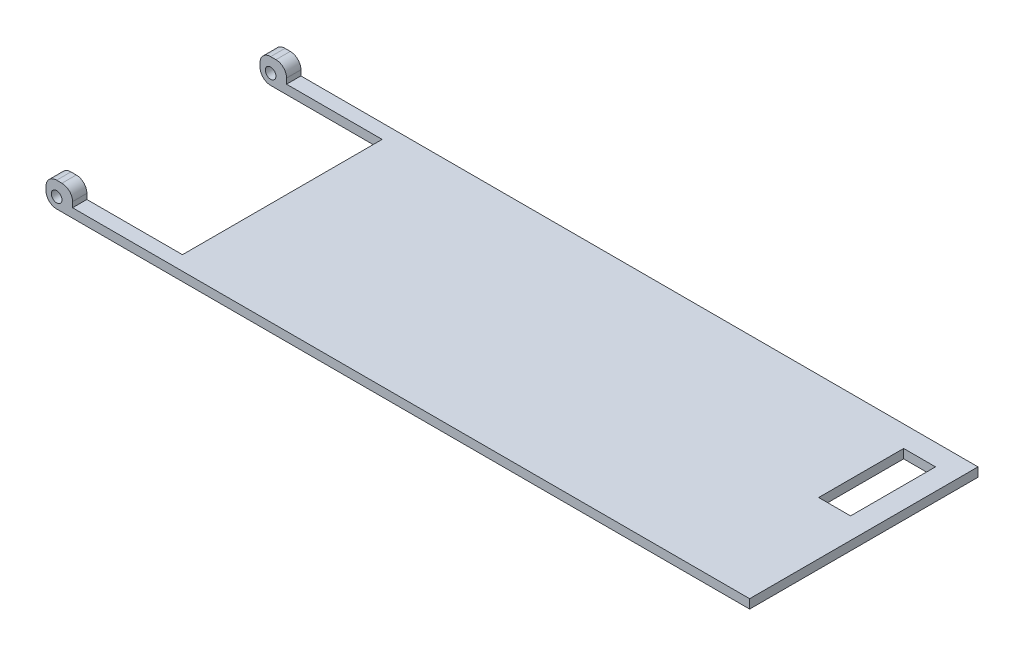
ISO-10303-21;
HEADER;
FILE_DESCRIPTION(('STEP AP214'),'2;1');
FILE_NAME('part.step','',(''),(''),'','','');
FILE_SCHEMA(('AUTOMOTIVE_DESIGN { 1 0 10303 214 1 1 1 1 }'));
ENDSEC;
DATA;
#1=APPLICATION_CONTEXT('core data for automotive mechanical design processes');
#2=APPLICATION_PROTOCOL_DEFINITION('international standard','automotive_design',2000,#1);
#3=PRODUCT_CONTEXT('',#1,'mechanical');
#4=PRODUCT('Part','Part','',(#3));
#5=PRODUCT_RELATED_PRODUCT_CATEGORY('part','',(#4));
#6=PRODUCT_DEFINITION_FORMATION('','',#4);
#7=PRODUCT_DEFINITION_CONTEXT('part definition',#1,'design');
#8=PRODUCT_DEFINITION('design','',#6,#7);
#9=PRODUCT_DEFINITION_SHAPE('','',#8);
#10=(LENGTH_UNIT() NAMED_UNIT(*) SI_UNIT(.MILLI.,.METRE.));
#11=(NAMED_UNIT(*) PLANE_ANGLE_UNIT() SI_UNIT($,.RADIAN.));
#12=(NAMED_UNIT(*) SI_UNIT($,.STERADIAN.) SOLID_ANGLE_UNIT());
#13=UNCERTAINTY_MEASURE_WITH_UNIT(LENGTH_MEASURE(1.E-05),#10,'distance_accuracy_value','');
#14=(GEOMETRIC_REPRESENTATION_CONTEXT(3) GLOBAL_UNCERTAINTY_ASSIGNED_CONTEXT((#13)) GLOBAL_UNIT_ASSIGNED_CONTEXT((#10,
#11,#12)) REPRESENTATION_CONTEXT('',''));
#15=CARTESIAN_POINT('',(0.,0.,0.));
#16=DIRECTION('',(0.,0.,1.));
#17=DIRECTION('',(1.,0.,0.));
#18=AXIS2_PLACEMENT_3D('',#15,#16,#17);
#19=CARTESIAN_POINT('',(0.,1.7,0.));
#20=DIRECTION('',(0.,-1.,0.));
#21=DIRECTION('',(0.,0.,-1.));
#22=AXIS2_PLACEMENT_3D('',#19,#20,#21);
#23=PLANE('',#22);
#24=DIRECTION('',(-1.,0.,0.));
#25=VECTOR('',#24,1.);
#26=CARTESIAN_POINT('',(56.25,1.7,-17.5));
#27=LINE('',#26,#25);
#28=CARTESIAN_POINT('',(62.25,1.7,-17.5));
#29=VERTEX_POINT('',#28);
#30=CARTESIAN_POINT('',(56.25,1.7,-17.5));
#31=VERTEX_POINT('',#30);
#32=EDGE_CURVE('E228',#29,#31,#27,.T.);
#33=ORIENTED_EDGE('',*,*,#32,.F.);
#34=DIRECTION('',(0.,0.,-1.));
#35=VECTOR('',#34,1.);
#36=CARTESIAN_POINT('',(62.25,1.7,-1.5));
#37=LINE('',#36,#35);
#38=CARTESIAN_POINT('',(62.25,1.7,-1.5));
#39=VERTEX_POINT('',#38);
#40=EDGE_CURVE('E61',#39,#29,#37,.T.);
#41=ORIENTED_EDGE('',*,*,#40,.F.);
#42=DIRECTION('',(1.,0.,0.));
#43=VECTOR('',#42,1.);
#44=CARTESIAN_POINT('',(56.25,1.7,-1.5));
#45=LINE('',#44,#43);
#46=CARTESIAN_POINT('',(56.25,1.7,-1.5));
#47=VERTEX_POINT('',#46);
#48=EDGE_CURVE('E215',#47,#39,#45,.T.);
#49=ORIENTED_EDGE('',*,*,#48,.F.);
#50=DIRECTION('',(0.,0.,1.));
#51=VECTOR('',#50,1.);
#52=CARTESIAN_POINT('',(56.25,1.7,-1.5));
#53=LINE('',#52,#51);
#54=EDGE_CURVE('E219',#31,#47,#53,.T.);
#55=ORIENTED_EDGE('',*,*,#54,.F.);
#56=EDGE_LOOP('',(#33,#41,#49,#55));
#57=FACE_BOUND('',#56,.T.);
#58=DIRECTION('',(-1.,0.,0.));
#59=VECTOR('',#58,1.);
#60=CARTESIAN_POINT('',(-66.25,1.7,-21.5));
#61=LINE('',#60,#59);
#62=CARTESIAN_POINT('',(66.25,1.7,-21.5));
#63=VERTEX_POINT('',#62);
#64=CARTESIAN_POINT('',(-61.25,1.7,-21.5));
#65=VERTEX_POINT('',#64);
#66=EDGE_CURVE('E336',#63,#65,#61,.T.);
#67=ORIENTED_EDGE('',*,*,#66,.T.);
#68=DIRECTION('',(0.,0.,1.));
#69=VECTOR('',#68,1.);
#70=CARTESIAN_POINT('',(-61.25,1.7,-18.8));
#71=LINE('',#70,#69);
#72=CARTESIAN_POINT('',(-61.25,1.7,-18.8));
#73=VERTEX_POINT('',#72);
#74=EDGE_CURVE('E247',#65,#73,#71,.T.);
#75=ORIENTED_EDGE('',*,*,#74,.T.);
#76=DIRECTION('',(-1.,0.,0.));
#77=VECTOR('',#76,1.);
#78=CARTESIAN_POINT('',(-66.25,1.7,-18.8));
#79=LINE('',#78,#77);
#80=CARTESIAN_POINT('',(-43.25,1.7,-18.8));
#81=VERTEX_POINT('',#80);
#82=EDGE_CURVE('E299',#81,#73,#79,.T.);
#83=ORIENTED_EDGE('',*,*,#82,.F.);
#84=DIRECTION('',(0.,0.,-1.));
#85=VECTOR('',#84,1.);
#86=CARTESIAN_POINT('',(-43.25,1.7,18.8));
#87=LINE('',#86,#85);
#88=CARTESIAN_POINT('',(-43.25,1.7,18.8));
#89=VERTEX_POINT('',#88);
#90=EDGE_CURVE('E310',#89,#81,#87,.T.);
#91=ORIENTED_EDGE('',*,*,#90,.F.);
#92=DIRECTION('',(1.,0.,0.));
#93=VECTOR('',#92,1.);
#94=CARTESIAN_POINT('',(-66.25,1.7,18.8));
#95=LINE('',#94,#93);
#96=CARTESIAN_POINT('',(-61.25,1.7,18.8));
#97=VERTEX_POINT('',#96);
#98=EDGE_CURVE('E294',#97,#89,#95,.T.);
#99=ORIENTED_EDGE('',*,*,#98,.F.);
#100=DIRECTION('',(0.,0.,-1.));
#101=VECTOR('',#100,1.);
#102=CARTESIAN_POINT('',(-61.25,1.7,18.8));
#103=LINE('',#102,#101);
#104=CARTESIAN_POINT('',(-61.25,1.7,21.5));
#105=VERTEX_POINT('',#104);
#106=EDGE_CURVE('E273',#105,#97,#103,.T.);
#107=ORIENTED_EDGE('',*,*,#106,.F.);
#108=DIRECTION('',(1.,0.,0.));
#109=VECTOR('',#108,1.);
#110=CARTESIAN_POINT('',(-66.25,1.7,21.5));
#111=LINE('',#110,#109);
#112=CARTESIAN_POINT('',(66.25,1.7,21.5));
#113=VERTEX_POINT('',#112);
#114=EDGE_CURVE('E341',#105,#113,#111,.T.);
#115=ORIENTED_EDGE('',*,*,#114,.T.);
#116=DIRECTION('',(0.,0.,-1.));
#117=VECTOR('',#116,1.);
#118=CARTESIAN_POINT('',(66.25,1.7,21.5));
#119=LINE('',#118,#117);
#120=EDGE_CURVE('E332',#113,#63,#119,.T.);
#121=ORIENTED_EDGE('',*,*,#120,.T.);
#122=EDGE_LOOP('',(#67,#75,#83,#91,#99,#107,#115,#121));
#123=FACE_BOUND('',#122,.T.);
#124=ADVANCED_FACE('F45',(#57,#123),#23,.F.);
#125=CARTESIAN_POINT('',(-66.25,1.7,21.5));
#126=DIRECTION('',(1.,0.,0.));
#127=DIRECTION('',(0.,0.,-1.));
#128=AXIS2_PLACEMENT_3D('',#125,#126,#127);
#129=PLANE('',#128);
#130=DIRECTION('',(0.,-1.,0.));
#131=VECTOR('',#130,1.);
#132=CARTESIAN_POINT('',(-66.25,1.7,-21.5));
#133=LINE('',#132,#131);
#134=CARTESIAN_POINT('',(-66.25,2.7,-21.5));
#135=VERTEX_POINT('',#134);
#136=CARTESIAN_POINT('',(-66.25,2.,-21.5));
#137=VERTEX_POINT('',#136);
#138=EDGE_CURVE('E361',#135,#137,#133,.T.);
#139=ORIENTED_EDGE('',*,*,#138,.T.);
#140=DIRECTION('',(0.,0.,1.));
#141=VECTOR('',#140,1.);
#142=CARTESIAN_POINT('',(-66.25,2.,-18.8));
#143=LINE('',#142,#141);
#144=CARTESIAN_POINT('',(-66.25,2.,-18.8));
#145=VERTEX_POINT('',#144);
#146=EDGE_CURVE('E412',#137,#145,#143,.T.);
#147=ORIENTED_EDGE('',*,*,#146,.T.);
#148=DIRECTION('',(0.,1.,0.));
#149=VECTOR('',#148,1.);
#150=CARTESIAN_POINT('',(-66.25,0.,-18.8));
#151=LINE('',#150,#149);
#152=CARTESIAN_POINT('',(-66.25,2.7,-18.8));
#153=VERTEX_POINT('',#152);
#154=EDGE_CURVE('E317',#145,#153,#151,.T.);
#155=ORIENTED_EDGE('',*,*,#154,.T.);
#156=DIRECTION('',(0.,0.,-1.));
#157=VECTOR('',#156,1.);
#158=CARTESIAN_POINT('',(-66.25,2.7,-21.5));
#159=LINE('',#158,#157);
#160=EDGE_CURVE('E408',#153,#135,#159,.T.);
#161=ORIENTED_EDGE('',*,*,#160,.T.);
#162=EDGE_LOOP('',(#139,#147,#155,#161));
#163=FACE_BOUND('',#162,.T.);
#164=ADVANCED_FACE('F456',(#163),#129,.F.);
#165=CARTESIAN_POINT('',(66.25,1.7,21.5));
#166=DIRECTION('',(-1.,0.,0.));
#167=DIRECTION('',(0.,0.,1.));
#168=AXIS2_PLACEMENT_3D('',#165,#166,#167);
#169=PLANE('',#168);
#170=DIRECTION('',(0.,0.,-1.));
#171=VECTOR('',#170,1.);
#172=CARTESIAN_POINT('',(66.25,0.,21.5));
#173=LINE('',#172,#171);
#174=CARTESIAN_POINT('',(66.25,0.,21.5));
#175=VERTEX_POINT('',#174);
#176=CARTESIAN_POINT('',(66.25,0.,-21.5));
#177=VERTEX_POINT('',#176);
#178=EDGE_CURVE('E321',#175,#177,#173,.T.);
#179=ORIENTED_EDGE('',*,*,#178,.T.);
#180=DIRECTION('',(0.,-1.,0.));
#181=VECTOR('',#180,1.);
#182=CARTESIAN_POINT('',(66.25,1.7,-21.5));
#183=LINE('',#182,#181);
#184=EDGE_CURVE('E365',#63,#177,#183,.T.);
#185=ORIENTED_EDGE('',*,*,#184,.F.);
#186=ORIENTED_EDGE('',*,*,#120,.F.);
#187=DIRECTION('',(0.,-1.,0.));
#188=VECTOR('',#187,1.);
#189=CARTESIAN_POINT('',(66.25,1.7,21.5));
#190=LINE('',#189,#188);
#191=EDGE_CURVE('E344',#113,#175,#190,.T.);
#192=ORIENTED_EDGE('',*,*,#191,.T.);
#193=EDGE_LOOP('',(#179,#185,#186,#192));
#194=FACE_BOUND('',#193,.T.);
#195=ADVANCED_FACE('F512',(#194),#169,.F.);
#196=CARTESIAN_POINT('',(-66.25,1.7,-21.5));
#197=DIRECTION('',(0.,0.,1.));
#198=DIRECTION('',(1.,0.,0.));
#199=AXIS2_PLACEMENT_3D('',#196,#197,#198);
#200=PLANE('',#199);
#201=CARTESIAN_POINT('',(-64.25,2.,-21.5));
#202=DIRECTION('',(0.,0.,1.));
#203=DIRECTION('',(1.,0.,0.));
#204=AXIS2_PLACEMENT_3D('',#201,#202,#203);
#205=CIRCLE('',#204,0.999999999999998);
#206=CARTESIAN_POINT('',(-65.25,2.,-21.5));
#207=VERTEX_POINT('',#206);
#208=EDGE_CURVE('E237',#207,#207,#205,.T.);
#209=ORIENTED_EDGE('',*,*,#208,.T.);
#210=EDGE_LOOP('',(#209));
#211=FACE_BOUND('',#210,.T.);
#212=DIRECTION('',(-1.,0.,0.));
#213=VECTOR('',#212,1.);
#214=CARTESIAN_POINT('',(-66.25,0.,-21.5));
#215=LINE('',#214,#213);
#216=CARTESIAN_POINT('',(-64.25,0.,-21.5));
#217=VERTEX_POINT('',#216);
#218=EDGE_CURVE('E348',#177,#217,#215,.T.);
#219=ORIENTED_EDGE('',*,*,#218,.T.);
#220=CARTESIAN_POINT('',(-64.25,2.,-21.5));
#221=DIRECTION('',(0.,0.,1.));
#222=DIRECTION('',(1.,0.,0.));
#223=AXIS2_PLACEMENT_3D('',#220,#221,#222);
#224=CIRCLE('',#223,2.);
#225=EDGE_CURVE('E434',#217,#137,#224,.F.);
#226=ORIENTED_EDGE('',*,*,#225,.T.);
#227=ORIENTED_EDGE('',*,*,#138,.F.);
#228=CARTESIAN_POINT('',(-64.25,2.7,-21.5));
#229=DIRECTION('',(0.,0.,1.));
#230=DIRECTION('',(1.,0.,0.));
#231=AXIS2_PLACEMENT_3D('',#228,#229,#230);
#232=CIRCLE('',#231,2.);
#233=CARTESIAN_POINT('',(-64.25,4.7,-21.5));
#234=VERTEX_POINT('',#233);
#235=EDGE_CURVE('E428',#135,#234,#232,.F.);
#236=ORIENTED_EDGE('',*,*,#235,.T.);
#237=DIRECTION('',(1.,0.,0.));
#238=VECTOR('',#237,1.);
#239=CARTESIAN_POINT('',(-66.25,4.7,-21.5));
#240=LINE('',#239,#238);
#241=CARTESIAN_POINT('',(-63.25,4.7,-21.5));
#242=VERTEX_POINT('',#241);
#243=EDGE_CURVE('E255',#234,#242,#240,.T.);
#244=ORIENTED_EDGE('',*,*,#243,.T.);
#245=CARTESIAN_POINT('',(-63.25,2.7,-21.5));
#246=DIRECTION('',(0.,0.,1.));
#247=DIRECTION('',(1.,0.,0.));
#248=AXIS2_PLACEMENT_3D('',#245,#246,#247);
#249=CIRCLE('',#248,2.);
#250=CARTESIAN_POINT('',(-61.25,2.7,-21.5));
#251=VERTEX_POINT('',#250);
#252=EDGE_CURVE('E431',#242,#251,#249,.F.);
#253=ORIENTED_EDGE('',*,*,#252,.T.);
#254=DIRECTION('',(0.,-1.,0.));
#255=VECTOR('',#254,1.);
#256=CARTESIAN_POINT('',(-61.25,4.7,-21.5));
#257=LINE('',#256,#255);
#258=EDGE_CURVE('E259',#251,#65,#257,.T.);
#259=ORIENTED_EDGE('',*,*,#258,.T.);
#260=ORIENTED_EDGE('',*,*,#66,.F.);
#261=ORIENTED_EDGE('',*,*,#184,.T.);
#262=EDGE_LOOP('',(#219,#226,#227,#236,#244,#253,#259,#260,#261));
#263=FACE_BOUND('',#262,.T.);
#264=ADVANCED_FACE('F459',(#211,#263),#200,.F.);
#265=DIRECTION('',(0.,1.,0.));
#266=VECTOR('',#265,1.);
#267=CARTESIAN_POINT('',(-66.25,0.,18.8));
#268=LINE('',#267,#266);
#269=CARTESIAN_POINT('',(-66.25,2.,18.8));
#270=VERTEX_POINT('',#269);
#271=CARTESIAN_POINT('',(-66.25,2.7,18.8));
#272=VERTEX_POINT('',#271);
#273=EDGE_CURVE('E307',#270,#272,#268,.T.);
#274=ORIENTED_EDGE('',*,*,#273,.F.);
#275=DIRECTION('',(0.,0.,1.));
#276=VECTOR('',#275,1.);
#277=CARTESIAN_POINT('',(-66.25,2.,21.5));
#278=LINE('',#277,#276);
#279=CARTESIAN_POINT('',(-66.25,2.,21.5));
#280=VERTEX_POINT('',#279);
#281=EDGE_CURVE('E372',#270,#280,#278,.T.);
#282=ORIENTED_EDGE('',*,*,#281,.T.);
#283=DIRECTION('',(0.,-1.,0.));
#284=VECTOR('',#283,1.);
#285=CARTESIAN_POINT('',(-66.25,1.7,21.5));
#286=LINE('',#285,#284);
#287=CARTESIAN_POINT('',(-66.25,2.7,21.5));
#288=VERTEX_POINT('',#287);
#289=EDGE_CURVE('E357',#288,#280,#286,.T.);
#290=ORIENTED_EDGE('',*,*,#289,.F.);
#291=DIRECTION('',(0.,0.,1.));
#292=VECTOR('',#291,1.);
#293=CARTESIAN_POINT('',(-66.25,2.7,18.8));
#294=LINE('',#293,#292);
#295=EDGE_CURVE('E369',#288,#272,#294,.F.);
#296=ORIENTED_EDGE('',*,*,#295,.T.);
#297=EDGE_LOOP('',(#274,#282,#290,#296));
#298=FACE_BOUND('',#297,.T.);
#299=ADVANCED_FACE('F503',(#298),#129,.F.);
#300=CARTESIAN_POINT('',(-66.25,1.7,21.5));
#301=DIRECTION('',(0.,0.,-1.));
#302=DIRECTION('',(-1.,0.,0.));
#303=AXIS2_PLACEMENT_3D('',#300,#301,#302);
#304=PLANE('',#303);
#305=CARTESIAN_POINT('',(-64.25,2.,21.5));
#306=DIRECTION('',(0.,0.,1.));
#307=DIRECTION('',(1.,0.,0.));
#308=AXIS2_PLACEMENT_3D('',#305,#306,#307);
#309=CIRCLE('',#308,0.999999999999998);
#310=CARTESIAN_POINT('',(-63.25,2.,21.5));
#311=VERTEX_POINT('',#310);
#312=EDGE_CURVE('E268',#311,#311,#309,.T.);
#313=ORIENTED_EDGE('',*,*,#312,.F.);
#314=EDGE_LOOP('',(#313));
#315=FACE_BOUND('',#314,.T.);
#316=ORIENTED_EDGE('',*,*,#289,.T.);
#317=CARTESIAN_POINT('',(-64.25,2.,21.5));
#318=DIRECTION('',(0.,0.,-1.));
#319=DIRECTION('',(-1.,0.,0.));
#320=AXIS2_PLACEMENT_3D('',#317,#318,#319);
#321=CIRCLE('',#320,2.);
#322=CARTESIAN_POINT('',(-64.25,0.,21.5));
#323=VERTEX_POINT('',#322);
#324=EDGE_CURVE('E382',#280,#323,#321,.F.);
#325=ORIENTED_EDGE('',*,*,#324,.T.);
#326=DIRECTION('',(1.,0.,0.));
#327=VECTOR('',#326,1.);
#328=CARTESIAN_POINT('',(-66.25,0.,21.5));
#329=LINE('',#328,#327);
#330=EDGE_CURVE('E337',#323,#175,#329,.T.);
#331=ORIENTED_EDGE('',*,*,#330,.T.);
#332=ORIENTED_EDGE('',*,*,#191,.F.);
#333=ORIENTED_EDGE('',*,*,#114,.F.);
#334=DIRECTION('',(0.,-1.,0.));
#335=VECTOR('',#334,1.);
#336=CARTESIAN_POINT('',(-61.25,4.7,21.5));
#337=LINE('',#336,#335);
#338=CARTESIAN_POINT('',(-61.25,2.7,21.5));
#339=VERTEX_POINT('',#338);
#340=EDGE_CURVE('E291',#339,#105,#337,.T.);
#341=ORIENTED_EDGE('',*,*,#340,.F.);
#342=CARTESIAN_POINT('',(-63.25,2.7,21.5));
#343=DIRECTION('',(0.,0.,-1.));
#344=DIRECTION('',(-1.,0.,0.));
#345=AXIS2_PLACEMENT_3D('',#342,#343,#344);
#346=CIRCLE('',#345,2.);
#347=CARTESIAN_POINT('',(-63.25,4.7,21.5));
#348=VERTEX_POINT('',#347);
#349=EDGE_CURVE('E379',#339,#348,#346,.F.);
#350=ORIENTED_EDGE('',*,*,#349,.T.);
#351=DIRECTION('',(1.,0.,0.));
#352=VECTOR('',#351,1.);
#353=CARTESIAN_POINT('',(-66.25,4.7,21.5));
#354=LINE('',#353,#352);
#355=CARTESIAN_POINT('',(-64.25,4.7,21.5));
#356=VERTEX_POINT('',#355);
#357=EDGE_CURVE('E277',#356,#348,#354,.T.);
#358=ORIENTED_EDGE('',*,*,#357,.F.);
#359=CARTESIAN_POINT('',(-64.25,2.7,21.5));
#360=DIRECTION('',(0.,0.,-1.));
#361=DIRECTION('',(-1.,0.,0.));
#362=AXIS2_PLACEMENT_3D('',#359,#360,#361);
#363=CIRCLE('',#362,2.);
#364=EDGE_CURVE('E376',#356,#288,#363,.F.);
#365=ORIENTED_EDGE('',*,*,#364,.T.);
#366=EDGE_LOOP('',(#316,#325,#331,#332,#333,#341,#350,#358,#365));
#367=FACE_BOUND('',#366,.T.);
#368=ADVANCED_FACE('F486',(#315,#367),#304,.F.);
#369=CARTESIAN_POINT('',(0.,0.,0.));
#370=DIRECTION('',(0.,-1.,0.));
#371=DIRECTION('',(0.,0.,-1.));
#372=AXIS2_PLACEMENT_3D('',#369,#370,#371);
#373=PLANE('',#372);
#374=DIRECTION('',(0.,0.,-1.));
#375=VECTOR('',#374,1.);
#376=CARTESIAN_POINT('',(62.25,0.,-1.5));
#377=LINE('',#376,#375);
#378=CARTESIAN_POINT('',(62.25,0.,-1.5));
#379=VERTEX_POINT('',#378);
#380=CARTESIAN_POINT('',(62.25,0.,-17.5));
#381=VERTEX_POINT('',#380);
#382=EDGE_CURVE('E196',#379,#381,#377,.T.);
#383=ORIENTED_EDGE('',*,*,#382,.T.);
#384=DIRECTION('',(-1.,0.,0.));
#385=VECTOR('',#384,1.);
#386=CARTESIAN_POINT('',(56.25,0.,-17.5));
#387=LINE('',#386,#385);
#388=CARTESIAN_POINT('',(56.25,0.,-17.5));
#389=VERTEX_POINT('',#388);
#390=EDGE_CURVE('E206',#381,#389,#387,.T.);
#391=ORIENTED_EDGE('',*,*,#390,.T.);
#392=DIRECTION('',(0.,0.,1.));
#393=VECTOR('',#392,1.);
#394=CARTESIAN_POINT('',(56.25,0.,-1.5));
#395=LINE('',#394,#393);
#396=CARTESIAN_POINT('',(56.25,0.,-1.5));
#397=VERTEX_POINT('',#396);
#398=EDGE_CURVE('E69',#389,#397,#395,.T.);
#399=ORIENTED_EDGE('',*,*,#398,.T.);
#400=DIRECTION('',(1.,0.,0.));
#401=VECTOR('',#400,1.);
#402=CARTESIAN_POINT('',(56.25,0.,-1.5));
#403=LINE('',#402,#401);
#404=EDGE_CURVE('E203',#397,#379,#403,.T.);
#405=ORIENTED_EDGE('',*,*,#404,.T.);
#406=EDGE_LOOP('',(#383,#391,#399,#405));
#407=FACE_BOUND('',#406,.T.);
#408=DIRECTION('',(-1.,0.,0.));
#409=VECTOR('',#408,1.);
#410=CARTESIAN_POINT('',(-66.25,0.,-18.8));
#411=LINE('',#410,#409);
#412=CARTESIAN_POINT('',(-43.25,0.,-18.8));
#413=VERTEX_POINT('',#412);
#414=CARTESIAN_POINT('',(-64.25,0.,-18.8));
#415=VERTEX_POINT('',#414);
#416=EDGE_CURVE('E303',#413,#415,#411,.T.);
#417=ORIENTED_EDGE('',*,*,#416,.T.);
#418=DIRECTION('',(0.,0.,1.));
#419=VECTOR('',#418,1.);
#420=CARTESIAN_POINT('',(-64.25,0.,-21.5));
#421=LINE('',#420,#419);
#422=EDGE_CURVE('E425',#415,#217,#421,.F.);
#423=ORIENTED_EDGE('',*,*,#422,.T.);
#424=ORIENTED_EDGE('',*,*,#218,.F.);
#425=ORIENTED_EDGE('',*,*,#178,.F.);
#426=ORIENTED_EDGE('',*,*,#330,.F.);
#427=DIRECTION('',(0.,0.,1.));
#428=VECTOR('',#427,1.);
#429=CARTESIAN_POINT('',(-64.25,0.,18.8));
#430=LINE('',#429,#428);
#431=CARTESIAN_POINT('',(-64.25,0.,18.8));
#432=VERTEX_POINT('',#431);
#433=EDGE_CURVE('E385',#323,#432,#430,.F.);
#434=ORIENTED_EDGE('',*,*,#433,.T.);
#435=DIRECTION('',(1.,0.,0.));
#436=VECTOR('',#435,1.);
#437=CARTESIAN_POINT('',(-66.25,0.,18.8));
#438=LINE('',#437,#436);
#439=CARTESIAN_POINT('',(-43.25,0.,18.8));
#440=VERTEX_POINT('',#439);
#441=EDGE_CURVE('E295',#432,#440,#438,.T.);
#442=ORIENTED_EDGE('',*,*,#441,.T.);
#443=DIRECTION('',(0.,0.,-1.));
#444=VECTOR('',#443,1.);
#445=CARTESIAN_POINT('',(-43.25,0.,18.8));
#446=LINE('',#445,#444);
#447=EDGE_CURVE('E298',#440,#413,#446,.T.);
#448=ORIENTED_EDGE('',*,*,#447,.T.);
#449=EDGE_LOOP('',(#417,#423,#424,#425,#426,#434,#442,#448));
#450=FACE_BOUND('',#449,.T.);
#451=ADVANCED_FACE('F211',(#407,#450),#373,.T.);
#452=CARTESIAN_POINT('',(-66.25,0.,-18.8));
#453=DIRECTION('',(0.,0.,-1.));
#454=DIRECTION('',(-1.,0.,0.));
#455=AXIS2_PLACEMENT_3D('',#452,#453,#454);
#456=PLANE('',#455);
#457=CARTESIAN_POINT('',(-64.25,2.,-18.8));
#458=DIRECTION('',(0.,0.,1.));
#459=DIRECTION('',(1.,0.,0.));
#460=AXIS2_PLACEMENT_3D('',#457,#458,#459);
#461=CIRCLE('',#460,0.999999999999998);
#462=CARTESIAN_POINT('',(-65.25,2.,-18.8));
#463=VERTEX_POINT('',#462);
#464=EDGE_CURVE('E243',#463,#463,#461,.T.);
#465=ORIENTED_EDGE('',*,*,#464,.F.);
#466=EDGE_LOOP('',(#465));
#467=FACE_BOUND('',#466,.T.);
#468=ORIENTED_EDGE('',*,*,#154,.F.);
#469=CARTESIAN_POINT('',(-64.25,2.,-18.8));
#470=DIRECTION('',(0.,0.,-1.));
#471=DIRECTION('',(-1.,0.,0.));
#472=AXIS2_PLACEMENT_3D('',#469,#470,#471);
#473=CIRCLE('',#472,2.);
#474=EDGE_CURVE('E422',#145,#415,#473,.F.);
#475=ORIENTED_EDGE('',*,*,#474,.T.);
#476=ORIENTED_EDGE('',*,*,#416,.F.);
#477=DIRECTION('',(0.,1.,0.));
#478=VECTOR('',#477,1.);
#479=CARTESIAN_POINT('',(-43.25,0.,-18.8));
#480=LINE('',#479,#478);
#481=EDGE_CURVE('E322',#413,#81,#480,.T.);
#482=ORIENTED_EDGE('',*,*,#481,.T.);
#483=ORIENTED_EDGE('',*,*,#82,.T.);
#484=DIRECTION('',(0.,-1.,0.));
#485=VECTOR('',#484,1.);
#486=CARTESIAN_POINT('',(-61.25,4.7,-18.8));
#487=LINE('',#486,#485);
#488=CARTESIAN_POINT('',(-61.25,2.7,-18.8));
#489=VERTEX_POINT('',#488);
#490=EDGE_CURVE('E265',#489,#73,#487,.T.);
#491=ORIENTED_EDGE('',*,*,#490,.F.);
#492=CARTESIAN_POINT('',(-63.25,2.7,-18.8));
#493=DIRECTION('',(0.,0.,-1.));
#494=DIRECTION('',(-1.,0.,0.));
#495=AXIS2_PLACEMENT_3D('',#492,#493,#494);
#496=CIRCLE('',#495,2.);
#497=CARTESIAN_POINT('',(-63.25,4.7,-18.8));
#498=VERTEX_POINT('',#497);
#499=EDGE_CURVE('E419',#489,#498,#496,.F.);
#500=ORIENTED_EDGE('',*,*,#499,.T.);
#501=DIRECTION('',(-1.,0.,0.));
#502=VECTOR('',#501,1.);
#503=CARTESIAN_POINT('',(-66.25,4.7,-18.8));
#504=LINE('',#503,#502);
#505=CARTESIAN_POINT('',(-64.25,4.7,-18.8));
#506=VERTEX_POINT('',#505);
#507=EDGE_CURVE('E251',#498,#506,#504,.T.);
#508=ORIENTED_EDGE('',*,*,#507,.T.);
#509=CARTESIAN_POINT('',(-64.25,2.7,-18.8));
#510=DIRECTION('',(0.,0.,-1.));
#511=DIRECTION('',(-1.,0.,0.));
#512=AXIS2_PLACEMENT_3D('',#509,#510,#511);
#513=CIRCLE('',#512,2.);
#514=EDGE_CURVE('E416',#506,#153,#513,.F.);
#515=ORIENTED_EDGE('',*,*,#514,.T.);
#516=EDGE_LOOP('',(#468,#475,#476,#482,#483,#491,#500,#508,#515));
#517=FACE_BOUND('',#516,.T.);
#518=ADVANCED_FACE('F451',(#467,#517),#456,.F.);
#519=CARTESIAN_POINT('',(-43.25,0.,18.8));
#520=DIRECTION('',(1.,0.,0.));
#521=DIRECTION('',(0.,0.,-1.));
#522=AXIS2_PLACEMENT_3D('',#519,#520,#521);
#523=PLANE('',#522);
#524=ORIENTED_EDGE('',*,*,#90,.T.);
#525=ORIENTED_EDGE('',*,*,#481,.F.);
#526=ORIENTED_EDGE('',*,*,#447,.F.);
#527=DIRECTION('',(0.,1.,0.));
#528=VECTOR('',#527,1.);
#529=CARTESIAN_POINT('',(-43.25,0.,18.8));
#530=LINE('',#529,#528);
#531=EDGE_CURVE('E325',#440,#89,#530,.T.);
#532=ORIENTED_EDGE('',*,*,#531,.T.);
#533=EDGE_LOOP('',(#524,#525,#526,#532));
#534=FACE_BOUND('',#533,.T.);
#535=ADVANCED_FACE('F469',(#534),#523,.F.);
#536=CARTESIAN_POINT('',(-66.25,0.,18.8));
#537=DIRECTION('',(0.,0.,1.));
#538=DIRECTION('',(1.,0.,0.));
#539=AXIS2_PLACEMENT_3D('',#536,#537,#538);
#540=PLANE('',#539);
#541=CARTESIAN_POINT('',(-64.25,2.,18.8));
#542=DIRECTION('',(0.,0.,1.));
#543=DIRECTION('',(1.,0.,0.));
#544=AXIS2_PLACEMENT_3D('',#541,#542,#543);
#545=CIRCLE('',#544,0.999999999999998);
#546=CARTESIAN_POINT('',(-63.25,2.,18.8));
#547=VERTEX_POINT('',#546);
#548=EDGE_CURVE('E269',#547,#547,#545,.T.);
#549=ORIENTED_EDGE('',*,*,#548,.T.);
#550=EDGE_LOOP('',(#549));
#551=FACE_BOUND('',#550,.T.);
#552=ORIENTED_EDGE('',*,*,#441,.F.);
#553=CARTESIAN_POINT('',(-64.25,2.,18.8));
#554=DIRECTION('',(0.,0.,1.));
#555=DIRECTION('',(1.,0.,0.));
#556=AXIS2_PLACEMENT_3D('',#553,#554,#555);
#557=CIRCLE('',#556,2.);
#558=EDGE_CURVE('E394',#432,#270,#557,.F.);
#559=ORIENTED_EDGE('',*,*,#558,.T.);
#560=ORIENTED_EDGE('',*,*,#273,.T.);
#561=CARTESIAN_POINT('',(-64.25,2.7,18.8));
#562=DIRECTION('',(0.,0.,1.));
#563=DIRECTION('',(1.,0.,0.));
#564=AXIS2_PLACEMENT_3D('',#561,#562,#563);
#565=CIRCLE('',#564,2.);
#566=CARTESIAN_POINT('',(-64.25,4.7,18.8));
#567=VERTEX_POINT('',#566);
#568=EDGE_CURVE('E388',#272,#567,#565,.F.);
#569=ORIENTED_EDGE('',*,*,#568,.T.);
#570=DIRECTION('',(-1.,0.,0.));
#571=VECTOR('',#570,1.);
#572=CARTESIAN_POINT('',(-66.25,4.7,18.8));
#573=LINE('',#572,#571);
#574=CARTESIAN_POINT('',(-63.25,4.7,18.8));
#575=VERTEX_POINT('',#574);
#576=EDGE_CURVE('E281',#575,#567,#573,.T.);
#577=ORIENTED_EDGE('',*,*,#576,.F.);
#578=CARTESIAN_POINT('',(-63.25,2.7,18.8));
#579=DIRECTION('',(0.,0.,1.));
#580=DIRECTION('',(1.,0.,0.));
#581=AXIS2_PLACEMENT_3D('',#578,#579,#580);
#582=CIRCLE('',#581,2.);
#583=CARTESIAN_POINT('',(-61.25,2.7,18.8));
#584=VERTEX_POINT('',#583);
#585=EDGE_CURVE('E391',#575,#584,#582,.F.);
#586=ORIENTED_EDGE('',*,*,#585,.T.);
#587=DIRECTION('',(0.,-1.,0.));
#588=VECTOR('',#587,1.);
#589=CARTESIAN_POINT('',(-61.25,4.7,18.8));
#590=LINE('',#589,#588);
#591=EDGE_CURVE('E285',#584,#97,#590,.T.);
#592=ORIENTED_EDGE('',*,*,#591,.T.);
#593=ORIENTED_EDGE('',*,*,#98,.T.);
#594=ORIENTED_EDGE('',*,*,#531,.F.);
#595=EDGE_LOOP('',(#552,#559,#560,#569,#577,#586,#592,#593,#594));
#596=FACE_BOUND('',#595,.T.);
#597=ADVANCED_FACE('F472',(#551,#596),#540,.F.);
#598=CARTESIAN_POINT('',(-61.25,4.7,18.8));
#599=DIRECTION('',(-1.,0.,0.));
#600=DIRECTION('',(0.,0.,1.));
#601=AXIS2_PLACEMENT_3D('',#598,#599,#600);
#602=PLANE('',#601);
#603=ORIENTED_EDGE('',*,*,#591,.F.);
#604=DIRECTION('',(0.,0.,-1.));
#605=VECTOR('',#604,1.);
#606=CARTESIAN_POINT('',(-61.25,2.7,21.5));
#607=LINE('',#606,#605);
#608=EDGE_CURVE('E405',#584,#339,#607,.F.);
#609=ORIENTED_EDGE('',*,*,#608,.T.);
#610=ORIENTED_EDGE('',*,*,#340,.T.);
#611=ORIENTED_EDGE('',*,*,#106,.T.);
#612=EDGE_LOOP('',(#603,#609,#610,#611));
#613=FACE_BOUND('',#612,.T.);
#614=ADVANCED_FACE('F481',(#613),#602,.F.);
#615=CARTESIAN_POINT('',(0.,4.7,0.));
#616=DIRECTION('',(0.,1.,0.));
#617=DIRECTION('',(0.,0.,1.));
#618=AXIS2_PLACEMENT_3D('',#615,#616,#617);
#619=PLANE('',#618);
#620=ORIENTED_EDGE('',*,*,#357,.T.);
#621=DIRECTION('',(0.,0.,-1.));
#622=VECTOR('',#621,1.);
#623=CARTESIAN_POINT('',(-63.25,4.7,18.8));
#624=LINE('',#623,#622);
#625=EDGE_CURVE('E401',#348,#575,#624,.T.);
#626=ORIENTED_EDGE('',*,*,#625,.T.);
#627=ORIENTED_EDGE('',*,*,#576,.T.);
#628=DIRECTION('',(0.,0.,1.));
#629=VECTOR('',#628,1.);
#630=CARTESIAN_POINT('',(-64.25,4.7,21.5));
#631=LINE('',#630,#629);
#632=EDGE_CURVE('E397',#567,#356,#631,.T.);
#633=ORIENTED_EDGE('',*,*,#632,.T.);
#634=EDGE_LOOP('',(#620,#626,#627,#633));
#635=FACE_BOUND('',#634,.T.);
#636=ADVANCED_FACE('F494',(#635),#619,.T.);
#637=CARTESIAN_POINT('',(-64.25,2.,18.8));
#638=DIRECTION('',(0.,0.,1.));
#639=DIRECTION('',(1.,0.,0.));
#640=AXIS2_PLACEMENT_3D('',#637,#638,#639);
#641=CYLINDRICAL_SURFACE('',#640,0.999999999999998);
#642=CARTESIAN_POINT('',(-63.25,2.,18.8));
#643=CARTESIAN_POINT('',(-63.25,2.,18.828125));
#644=CARTESIAN_POINT('',(-63.25,2.,18.85625));
#645=CARTESIAN_POINT('',(-63.25,2.,18.9125));
#646=CARTESIAN_POINT('',(-63.25,2.,18.940625));
#647=CARTESIAN_POINT('',(-63.25,2.,18.996875));
#648=CARTESIAN_POINT('',(-63.25,2.,19.025));
#649=CARTESIAN_POINT('',(-63.25,2.,19.08125));
#650=CARTESIAN_POINT('',(-63.25,2.,19.109375));
#651=CARTESIAN_POINT('',(-63.25,2.,19.165625));
#652=CARTESIAN_POINT('',(-63.25,2.,19.19375));
#653=CARTESIAN_POINT('',(-63.25,2.,19.25));
#654=CARTESIAN_POINT('',(-63.25,2.,19.278125));
#655=CARTESIAN_POINT('',(-63.25,2.,19.334375));
#656=CARTESIAN_POINT('',(-63.25,2.,19.3625));
#657=CARTESIAN_POINT('',(-63.25,2.,19.41875));
#658=CARTESIAN_POINT('',(-63.25,2.,19.446875));
#659=CARTESIAN_POINT('',(-63.25,2.,19.503125));
#660=CARTESIAN_POINT('',(-63.25,2.,19.53125));
#661=CARTESIAN_POINT('',(-63.25,2.,19.5875));
#662=CARTESIAN_POINT('',(-63.25,2.,19.615625));
#663=CARTESIAN_POINT('',(-63.25,2.,19.671875));
#664=CARTESIAN_POINT('',(-63.25,2.,19.7));
#665=CARTESIAN_POINT('',(-63.25,2.,19.75625));
#666=CARTESIAN_POINT('',(-63.25,2.,19.784375));
#667=CARTESIAN_POINT('',(-63.25,2.,19.840625));
#668=CARTESIAN_POINT('',(-63.25,2.,19.86875));
#669=CARTESIAN_POINT('',(-63.25,2.,19.925));
#670=CARTESIAN_POINT('',(-63.25,2.,19.953125));
#671=CARTESIAN_POINT('',(-63.25,2.,20.009375));
#672=CARTESIAN_POINT('',(-63.25,2.,20.0375));
#673=CARTESIAN_POINT('',(-63.25,2.,20.09375));
#674=CARTESIAN_POINT('',(-63.25,2.,20.121875));
#675=CARTESIAN_POINT('',(-63.25,2.,20.178125));
#676=CARTESIAN_POINT('',(-63.25,2.,20.20625));
#677=CARTESIAN_POINT('',(-63.25,2.,20.2625));
#678=CARTESIAN_POINT('',(-63.25,2.,20.290625));
#679=CARTESIAN_POINT('',(-63.25,2.,20.346875));
#680=CARTESIAN_POINT('',(-63.25,2.,20.375));
#681=CARTESIAN_POINT('',(-63.25,2.,20.43125));
#682=CARTESIAN_POINT('',(-63.25,2.,20.459375));
#683=CARTESIAN_POINT('',(-63.25,2.,20.515625));
#684=CARTESIAN_POINT('',(-63.25,2.,20.54375));
#685=CARTESIAN_POINT('',(-63.25,2.,20.6));
#686=CARTESIAN_POINT('',(-63.25,2.,20.628125));
#687=CARTESIAN_POINT('',(-63.25,2.,20.684375));
#688=CARTESIAN_POINT('',(-63.25,2.,20.7125));
#689=CARTESIAN_POINT('',(-63.25,2.,20.76875));
#690=CARTESIAN_POINT('',(-63.25,2.,20.796875));
#691=CARTESIAN_POINT('',(-63.25,2.,20.853125));
#692=CARTESIAN_POINT('',(-63.25,2.,20.88125));
#693=CARTESIAN_POINT('',(-63.25,2.,20.9375));
#694=CARTESIAN_POINT('',(-63.25,2.,20.965625));
#695=CARTESIAN_POINT('',(-63.25,2.,21.021875));
#696=CARTESIAN_POINT('',(-63.25,2.,21.05));
#697=CARTESIAN_POINT('',(-63.25,2.,21.10625));
#698=CARTESIAN_POINT('',(-63.25,2.,21.134375));
#699=CARTESIAN_POINT('',(-63.25,2.,21.190625));
#700=CARTESIAN_POINT('',(-63.25,2.,21.21875));
#701=CARTESIAN_POINT('',(-63.25,2.,21.275));
#702=CARTESIAN_POINT('',(-63.25,2.,21.303125));
#703=CARTESIAN_POINT('',(-63.25,2.,21.359375));
#704=CARTESIAN_POINT('',(-63.25,2.,21.3875));
#705=CARTESIAN_POINT('',(-63.25,2.,21.44375));
#706=CARTESIAN_POINT('',(-63.25,2.,21.471875));
#707=CARTESIAN_POINT('',(-63.25,2.,21.5));
#708=B_SPLINE_CURVE_WITH_KNOTS('',3,(#642,#643,#644,#645,#646,#647,#648,#649,#650,#651,#652,
#653,#654,#655,#656,#657,#658,#659,#660,#661,#662,#663,#664,#665,#666,#667,#668,#669,#670,#671,
#672,#673,#674,#675,#676,#677,#678,#679,#680,#681,#682,#683,#684,#685,#686,#687,#688,#689,#690,
#691,#692,#693,#694,#695,#696,#697,#698,#699,#700,#701,#702,#703,#704,#705,#706,#707),
.UNSPECIFIED.,.F.,.F.,(4,2,2,2,2,2,2,2,2,2,2,2,2,2,2,2,2,2,2,2,2,2,2,2,2,2,2,2,2,2,2,2,4),(0.,
0.0843750000000011,0.168750000000002,0.253125000000003,0.337500000000001,0.421875000000002,
0.506250000000003,0.590625000000001,0.675000000000002,0.759375000000003,0.843750000000001,
0.928125000000002,1.0125,1.096875,1.18125,1.265625,1.35,1.434375,1.51875,1.603125,1.6875,
1.771875,1.85625,1.940625,2.025,2.109375,2.19375,2.278125,2.3625,2.446875,2.53125,2.615625,2.7),.UNSPECIFIED.);
#709=EDGE_CURVE('BSEAM552',#547,#311,#708,.T.);
#710=ORIENTED_EDGE('',*,*,#548,.F.);
#711=ORIENTED_EDGE('',*,*,#312,.T.);
#712=ORIENTED_EDGE('',*,*,#709,.T.);
#713=ORIENTED_EDGE('',*,*,#709,.F.);
#714=EDGE_LOOP('',(#710,#712,#711,#713));
#715=FACE_BOUND('',#714,.T.);
#716=ADVANCED_FACE('F552',(#715),#641,.F.);
#717=CARTESIAN_POINT('',(-64.25,2.,21.5));
#718=DIRECTION('',(0.,0.,-1.));
#719=DIRECTION('',(-1.,0.,0.));
#720=AXIS2_PLACEMENT_3D('',#717,#718,#719);
#721=CYLINDRICAL_SURFACE('',#720,2.);
#722=ORIENTED_EDGE('',*,*,#558,.F.);
#723=ORIENTED_EDGE('',*,*,#433,.F.);
#724=ORIENTED_EDGE('',*,*,#324,.F.);
#725=ORIENTED_EDGE('',*,*,#281,.F.);
#726=EDGE_LOOP('',(#722,#723,#724,#725));
#727=FACE_BOUND('',#726,.T.);
#728=ADVANCED_FACE('F506',(#727),#721,.T.);
#729=CARTESIAN_POINT('',(-63.25,2.7,0.));
#730=DIRECTION('',(0.,0.,1.));
#731=DIRECTION('',(1.,0.,0.));
#732=AXIS2_PLACEMENT_3D('',#729,#730,#731);
#733=CYLINDRICAL_SURFACE('',#732,2.);
#734=ORIENTED_EDGE('',*,*,#349,.F.);
#735=ORIENTED_EDGE('',*,*,#608,.F.);
#736=ORIENTED_EDGE('',*,*,#585,.F.);
#737=ORIENTED_EDGE('',*,*,#625,.F.);
#738=EDGE_LOOP('',(#734,#735,#736,#737));
#739=FACE_BOUND('',#738,.T.);
#740=ADVANCED_FACE('F491',(#739),#733,.T.);
#741=CARTESIAN_POINT('',(-64.25,2.7,0.));
#742=DIRECTION('',(0.,0.,-1.));
#743=DIRECTION('',(-1.,0.,0.));
#744=AXIS2_PLACEMENT_3D('',#741,#742,#743);
#745=CYLINDRICAL_SURFACE('',#744,2.);
#746=ORIENTED_EDGE('',*,*,#568,.F.);
#747=ORIENTED_EDGE('',*,*,#295,.F.);
#748=ORIENTED_EDGE('',*,*,#364,.F.);
#749=ORIENTED_EDGE('',*,*,#632,.F.);
#750=EDGE_LOOP('',(#746,#747,#748,#749));
#751=FACE_BOUND('',#750,.T.);
#752=ADVANCED_FACE('F500',(#751),#745,.T.);
#753=CARTESIAN_POINT('',(-61.25,4.7,-18.8));
#754=DIRECTION('',(1.,0.,0.));
#755=DIRECTION('',(0.,0.,-1.));
#756=AXIS2_PLACEMENT_3D('',#753,#754,#755);
#757=PLANE('',#756);
#758=ORIENTED_EDGE('',*,*,#258,.F.);
#759=DIRECTION('',(0.,0.,1.));
#760=VECTOR('',#759,1.);
#761=CARTESIAN_POINT('',(-61.25,2.7,-18.8));
#762=LINE('',#761,#760);
#763=EDGE_CURVE('E437',#251,#489,#762,.T.);
#764=ORIENTED_EDGE('',*,*,#763,.T.);
#765=ORIENTED_EDGE('',*,*,#490,.T.);
#766=ORIENTED_EDGE('',*,*,#74,.F.);
#767=EDGE_LOOP('',(#758,#764,#765,#766));
#768=FACE_BOUND('',#767,.T.);
#769=ADVANCED_FACE('F519',(#768),#757,.T.);
#770=CARTESIAN_POINT('',(0.,4.7,0.));
#771=DIRECTION('',(0.,1.,0.));
#772=DIRECTION('',(0.,0.,-1.));
#773=AXIS2_PLACEMENT_3D('',#770,#771,#772);
#774=PLANE('',#773);
#775=ORIENTED_EDGE('',*,*,#507,.F.);
#776=DIRECTION('',(0.,0.,1.));
#777=VECTOR('',#776,1.);
#778=CARTESIAN_POINT('',(-63.25,4.7,0.));
#779=LINE('',#778,#777);
#780=EDGE_CURVE('E11',#498,#242,#779,.F.);
#781=ORIENTED_EDGE('',*,*,#780,.T.);
#782=ORIENTED_EDGE('',*,*,#243,.F.);
#783=DIRECTION('',(0.,0.,-1.));
#784=VECTOR('',#783,1.);
#785=CARTESIAN_POINT('',(-64.25,4.7,-18.8));
#786=LINE('',#785,#784);
#787=EDGE_CURVE('E54',#234,#506,#786,.F.);
#788=ORIENTED_EDGE('',*,*,#787,.T.);
#789=EDGE_LOOP('',(#775,#781,#782,#788));
#790=FACE_BOUND('',#789,.T.);
#791=ADVANCED_FACE('F445',(#790),#774,.T.);
#792=CARTESIAN_POINT('',(-64.25,2.,-18.8));
#793=DIRECTION('',(0.,0.,-1.));
#794=DIRECTION('',(-1.,0.,0.));
#795=AXIS2_PLACEMENT_3D('',#792,#793,#794);
#796=CYLINDRICAL_SURFACE('',#795,0.999999999999998);
#797=CARTESIAN_POINT('',(-65.25,2.,-18.8));
#798=CARTESIAN_POINT('',(-65.25,2.,-18.828125));
#799=CARTESIAN_POINT('',(-65.25,2.,-18.85625));
#800=CARTESIAN_POINT('',(-65.25,2.,-18.9125));
#801=CARTESIAN_POINT('',(-65.25,2.,-18.940625));
#802=CARTESIAN_POINT('',(-65.25,2.,-18.996875));
#803=CARTESIAN_POINT('',(-65.25,2.,-19.025));
#804=CARTESIAN_POINT('',(-65.25,2.,-19.08125));
#805=CARTESIAN_POINT('',(-65.25,2.,-19.109375));
#806=CARTESIAN_POINT('',(-65.25,2.,-19.165625));
#807=CARTESIAN_POINT('',(-65.25,2.,-19.19375));
#808=CARTESIAN_POINT('',(-65.25,2.,-19.25));
#809=CARTESIAN_POINT('',(-65.25,2.,-19.278125));
#810=CARTESIAN_POINT('',(-65.25,2.,-19.334375));
#811=CARTESIAN_POINT('',(-65.25,2.,-19.3625));
#812=CARTESIAN_POINT('',(-65.25,2.,-19.41875));
#813=CARTESIAN_POINT('',(-65.25,2.,-19.446875));
#814=CARTESIAN_POINT('',(-65.25,2.,-19.503125));
#815=CARTESIAN_POINT('',(-65.25,2.,-19.53125));
#816=CARTESIAN_POINT('',(-65.25,2.,-19.5875));
#817=CARTESIAN_POINT('',(-65.25,2.,-19.615625));
#818=CARTESIAN_POINT('',(-65.25,2.,-19.671875));
#819=CARTESIAN_POINT('',(-65.25,2.,-19.7));
#820=CARTESIAN_POINT('',(-65.25,2.,-19.75625));
#821=CARTESIAN_POINT('',(-65.25,2.,-19.784375));
#822=CARTESIAN_POINT('',(-65.25,2.,-19.840625));
#823=CARTESIAN_POINT('',(-65.25,2.,-19.86875));
#824=CARTESIAN_POINT('',(-65.25,2.,-19.925));
#825=CARTESIAN_POINT('',(-65.25,2.,-19.953125));
#826=CARTESIAN_POINT('',(-65.25,2.,-20.009375));
#827=CARTESIAN_POINT('',(-65.25,2.,-20.0375));
#828=CARTESIAN_POINT('',(-65.25,2.,-20.09375));
#829=CARTESIAN_POINT('',(-65.25,2.,-20.121875));
#830=CARTESIAN_POINT('',(-65.25,2.,-20.178125));
#831=CARTESIAN_POINT('',(-65.25,2.,-20.20625));
#832=CARTESIAN_POINT('',(-65.25,2.,-20.2625));
#833=CARTESIAN_POINT('',(-65.25,2.,-20.290625));
#834=CARTESIAN_POINT('',(-65.25,2.,-20.346875));
#835=CARTESIAN_POINT('',(-65.25,2.,-20.375));
#836=CARTESIAN_POINT('',(-65.25,2.,-20.43125));
#837=CARTESIAN_POINT('',(-65.25,2.,-20.459375));
#838=CARTESIAN_POINT('',(-65.25,2.,-20.515625));
#839=CARTESIAN_POINT('',(-65.25,2.,-20.54375));
#840=CARTESIAN_POINT('',(-65.25,2.,-20.6));
#841=CARTESIAN_POINT('',(-65.25,2.,-20.628125));
#842=CARTESIAN_POINT('',(-65.25,2.,-20.684375));
#843=CARTESIAN_POINT('',(-65.25,2.,-20.7125));
#844=CARTESIAN_POINT('',(-65.25,2.,-20.76875));
#845=CARTESIAN_POINT('',(-65.25,2.,-20.796875));
#846=CARTESIAN_POINT('',(-65.25,2.,-20.853125));
#847=CARTESIAN_POINT('',(-65.25,2.,-20.88125));
#848=CARTESIAN_POINT('',(-65.25,2.,-20.9375));
#849=CARTESIAN_POINT('',(-65.25,2.,-20.965625));
#850=CARTESIAN_POINT('',(-65.25,2.,-21.021875));
#851=CARTESIAN_POINT('',(-65.25,2.,-21.05));
#852=CARTESIAN_POINT('',(-65.25,2.,-21.10625));
#853=CARTESIAN_POINT('',(-65.25,2.,-21.134375));
#854=CARTESIAN_POINT('',(-65.25,2.,-21.190625));
#855=CARTESIAN_POINT('',(-65.25,2.,-21.21875));
#856=CARTESIAN_POINT('',(-65.25,2.,-21.275));
#857=CARTESIAN_POINT('',(-65.25,2.,-21.303125));
#858=CARTESIAN_POINT('',(-65.25,2.,-21.359375));
#859=CARTESIAN_POINT('',(-65.25,2.,-21.3875));
#860=CARTESIAN_POINT('',(-65.25,2.,-21.44375));
#861=CARTESIAN_POINT('',(-65.25,2.,-21.471875));
#862=CARTESIAN_POINT('',(-65.25,2.,-21.5));
#863=B_SPLINE_CURVE_WITH_KNOTS('',3,(#797,#798,#799,#800,#801,#802,#803,#804,#805,#806,#807,
#808,#809,#810,#811,#812,#813,#814,#815,#816,#817,#818,#819,#820,#821,#822,#823,#824,#825,#826,
#827,#828,#829,#830,#831,#832,#833,#834,#835,#836,#837,#838,#839,#840,#841,#842,#843,#844,#845,
#846,#847,#848,#849,#850,#851,#852,#853,#854,#855,#856,#857,#858,#859,#860,#861,#862),
.UNSPECIFIED.,.F.,.F.,(4,2,2,2,2,2,2,2,2,2,2,2,2,2,2,2,2,2,2,2,2,2,2,2,2,2,2,2,2,2,2,2,4),(0.,
0.0843749999999976,0.168749999999999,0.253125,0.337499999999998,0.421874999999999,0.50625,
0.590624999999997,0.674999999999998,0.759375,0.843749999999997,0.928124999999998,1.0125,
1.096875,1.18125,1.265625,1.35,1.434375,1.51875,1.603125,1.6875,1.771875,1.85625,1.940625,2.025,
2.109375,2.19375,2.278125,2.3625,2.446875,2.53125,2.615625,2.7),.UNSPECIFIED.);
#864=EDGE_CURVE('BSEAM527',#463,#207,#863,.T.);
#865=ORIENTED_EDGE('',*,*,#464,.T.);
#866=ORIENTED_EDGE('',*,*,#208,.F.);
#867=ORIENTED_EDGE('',*,*,#864,.T.);
#868=ORIENTED_EDGE('',*,*,#864,.F.);
#869=EDGE_LOOP('',(#865,#867,#866,#868));
#870=FACE_BOUND('',#869,.T.);
#871=ADVANCED_FACE('F527',(#870),#796,.F.);
#872=CARTESIAN_POINT('',(-64.25,2.,21.5));
#873=DIRECTION('',(0.,0.,-1.));
#874=DIRECTION('',(-1.,0.,0.));
#875=AXIS2_PLACEMENT_3D('',#872,#873,#874);
#876=CYLINDRICAL_SURFACE('',#875,2.);
#877=ORIENTED_EDGE('',*,*,#225,.F.);
#878=ORIENTED_EDGE('',*,*,#422,.F.);
#879=ORIENTED_EDGE('',*,*,#474,.F.);
#880=ORIENTED_EDGE('',*,*,#146,.F.);
#881=EDGE_LOOP('',(#877,#878,#879,#880));
#882=FACE_BOUND('',#881,.T.);
#883=ADVANCED_FACE('F463',(#882),#876,.T.);
#884=CARTESIAN_POINT('',(-63.25,2.7,-18.8));
#885=DIRECTION('',(0.,0.,1.));
#886=DIRECTION('',(1.,0.,0.));
#887=AXIS2_PLACEMENT_3D('',#884,#885,#886);
#888=CYLINDRICAL_SURFACE('',#887,2.);
#889=ORIENTED_EDGE('',*,*,#252,.F.);
#890=ORIENTED_EDGE('',*,*,#780,.F.);
#891=ORIENTED_EDGE('',*,*,#499,.F.);
#892=ORIENTED_EDGE('',*,*,#763,.F.);
#893=EDGE_LOOP('',(#889,#890,#891,#892));
#894=FACE_BOUND('',#893,.T.);
#895=ADVANCED_FACE('F521',(#894),#888,.T.);
#896=CARTESIAN_POINT('',(-64.25,2.7,21.5));
#897=DIRECTION('',(0.,0.,1.));
#898=DIRECTION('',(1.,0.,0.));
#899=AXIS2_PLACEMENT_3D('',#896,#897,#898);
#900=CYLINDRICAL_SURFACE('',#899,2.);
#901=ORIENTED_EDGE('',*,*,#514,.F.);
#902=ORIENTED_EDGE('',*,*,#787,.F.);
#903=ORIENTED_EDGE('',*,*,#235,.F.);
#904=ORIENTED_EDGE('',*,*,#160,.F.);
#905=EDGE_LOOP('',(#901,#902,#903,#904));
#906=FACE_BOUND('',#905,.T.);
#907=ADVANCED_FACE('F47',(#906),#900,.T.);
#908=CARTESIAN_POINT('',(62.25,0.,-1.5));
#909=DIRECTION('',(1.,0.,0.));
#910=DIRECTION('',(0.,0.,-1.));
#911=AXIS2_PLACEMENT_3D('',#908,#909,#910);
#912=PLANE('',#911);
#913=ORIENTED_EDGE('',*,*,#40,.T.);
#914=DIRECTION('',(0.,1.,0.));
#915=VECTOR('',#914,1.);
#916=CARTESIAN_POINT('',(62.25,0.,-17.5));
#917=LINE('',#916,#915);
#918=EDGE_CURVE('E192',#381,#29,#917,.T.);
#919=ORIENTED_EDGE('',*,*,#918,.F.);
#920=ORIENTED_EDGE('',*,*,#382,.F.);
#921=DIRECTION('',(0.,1.,0.));
#922=VECTOR('',#921,1.);
#923=CARTESIAN_POINT('',(62.25,0.,-1.5));
#924=LINE('',#923,#922);
#925=EDGE_CURVE('E234',#379,#39,#924,.T.);
#926=ORIENTED_EDGE('',*,*,#925,.T.);
#927=EDGE_LOOP('',(#913,#919,#920,#926));
#928=FACE_BOUND('',#927,.T.);
#929=ADVANCED_FACE('F194',(#928),#912,.F.);
#930=CARTESIAN_POINT('',(56.25,0.,-1.5));
#931=DIRECTION('',(0.,0.,1.));
#932=DIRECTION('',(1.,0.,0.));
#933=AXIS2_PLACEMENT_3D('',#930,#931,#932);
#934=PLANE('',#933);
#935=ORIENTED_EDGE('',*,*,#48,.T.);
#936=ORIENTED_EDGE('',*,*,#925,.F.);
#937=ORIENTED_EDGE('',*,*,#404,.F.);
#938=DIRECTION('',(0.,1.,0.));
#939=VECTOR('',#938,1.);
#940=CARTESIAN_POINT('',(56.25,0.,-1.5));
#941=LINE('',#940,#939);
#942=EDGE_CURVE('E238',#397,#47,#941,.T.);
#943=ORIENTED_EDGE('',*,*,#942,.T.);
#944=EDGE_LOOP('',(#935,#936,#937,#943));
#945=FACE_BOUND('',#944,.T.);
#946=ADVANCED_FACE('F682',(#945),#934,.F.);
#947=CARTESIAN_POINT('',(56.25,0.,-1.5));
#948=DIRECTION('',(-1.,0.,0.));
#949=DIRECTION('',(0.,0.,1.));
#950=AXIS2_PLACEMENT_3D('',#947,#948,#949);
#951=PLANE('',#950);
#952=ORIENTED_EDGE('',*,*,#54,.T.);
#953=ORIENTED_EDGE('',*,*,#942,.F.);
#954=ORIENTED_EDGE('',*,*,#398,.F.);
#955=DIRECTION('',(0.,1.,0.));
#956=VECTOR('',#955,1.);
#957=CARTESIAN_POINT('',(56.25,0.,-17.5));
#958=LINE('',#957,#956);
#959=EDGE_CURVE('E202',#389,#31,#958,.T.);
#960=ORIENTED_EDGE('',*,*,#959,.T.);
#961=EDGE_LOOP('',(#952,#953,#954,#960));
#962=FACE_BOUND('',#961,.T.);
#963=ADVANCED_FACE('F691',(#962),#951,.F.);
#964=CARTESIAN_POINT('',(56.25,0.,-17.5));
#965=DIRECTION('',(0.,0.,-1.));
#966=DIRECTION('',(-1.,0.,0.));
#967=AXIS2_PLACEMENT_3D('',#964,#965,#966);
#968=PLANE('',#967);
#969=ORIENTED_EDGE('',*,*,#32,.T.);
#970=ORIENTED_EDGE('',*,*,#959,.F.);
#971=ORIENTED_EDGE('',*,*,#390,.F.);
#972=ORIENTED_EDGE('',*,*,#918,.T.);
#973=EDGE_LOOP('',(#969,#970,#971,#972));
#974=FACE_BOUND('',#973,.T.);
#975=ADVANCED_FACE('F207',(#974),#968,.F.);
#976=CLOSED_SHELL('',(#124,#164,#195,#264,#299,#368,#451,#518,#535,#597,#614,#636,#716,#728,
#740,#752,#769,#791,#871,#883,#895,#907,#929,#946,#963,#975));
#977=MANIFOLD_SOLID_BREP('B2',#976);
#978=ADVANCED_BREP_SHAPE_REPRESENTATION('',(#18,#977),#14);
#979=SHAPE_DEFINITION_REPRESENTATION(#9,#978);
ENDSEC;
END-ISO-10303-21;
